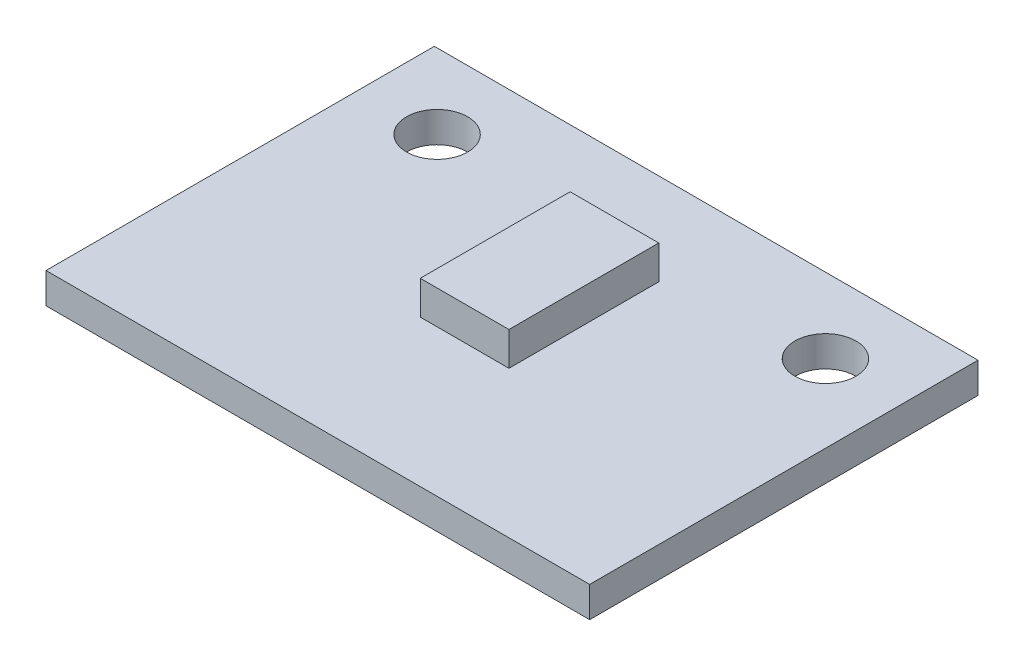
ISO-10303-21;
HEADER;
FILE_DESCRIPTION(('STEP AP214'),'2;1');
FILE_NAME('part.step','',(''),(''),'','','');
FILE_SCHEMA(('AUTOMOTIVE_DESIGN { 1 0 10303 214 1 1 1 1 }'));
ENDSEC;
DATA;
#1=APPLICATION_CONTEXT('core data for automotive mechanical design processes');
#2=APPLICATION_PROTOCOL_DEFINITION('international standard','automotive_design',2000,#1);
#3=PRODUCT_CONTEXT('',#1,'mechanical');
#4=PRODUCT('Part','Part','',(#3));
#5=PRODUCT_RELATED_PRODUCT_CATEGORY('part','',(#4));
#6=PRODUCT_DEFINITION_FORMATION('','',#4);
#7=PRODUCT_DEFINITION_CONTEXT('part definition',#1,'design');
#8=PRODUCT_DEFINITION('design','',#6,#7);
#9=PRODUCT_DEFINITION_SHAPE('','',#8);
#10=(LENGTH_UNIT() NAMED_UNIT(*) SI_UNIT(.MILLI.,.METRE.));
#11=(NAMED_UNIT(*) PLANE_ANGLE_UNIT() SI_UNIT($,.RADIAN.));
#12=(NAMED_UNIT(*) SI_UNIT($,.STERADIAN.) SOLID_ANGLE_UNIT());
#13=UNCERTAINTY_MEASURE_WITH_UNIT(LENGTH_MEASURE(1.E-05),#10,'distance_accuracy_value','');
#14=(GEOMETRIC_REPRESENTATION_CONTEXT(3) GLOBAL_UNCERTAINTY_ASSIGNED_CONTEXT((#13)) GLOBAL_UNIT_ASSIGNED_CONTEXT((#10,
#11,#12)) REPRESENTATION_CONTEXT('',''));
#15=CARTESIAN_POINT('',(0.,0.,0.));
#16=DIRECTION('',(0.,0.,1.));
#17=DIRECTION('',(1.,0.,0.));
#18=AXIS2_PLACEMENT_3D('',#15,#16,#17);
#19=CARTESIAN_POINT('',(0.,1.,6.35));
#20=DIRECTION('',(0.,0.,-1.));
#21=DIRECTION('',(-1.,0.,0.));
#22=AXIS2_PLACEMENT_3D('',#19,#20,#21);
#23=PLANE('',#22);
#24=DIRECTION('',(1.,0.,0.));
#25=VECTOR('',#24,1.);
#26=CARTESIAN_POINT('',(0.,0.,6.35));
#27=LINE('',#26,#25);
#28=CARTESIAN_POINT('',(-8.89,0.,6.35));
#29=VERTEX_POINT('',#28);
#30=CARTESIAN_POINT('',(8.89,0.,6.35));
#31=VERTEX_POINT('',#30);
#32=EDGE_CURVE('E206',#29,#31,#27,.T.);
#33=ORIENTED_EDGE('',*,*,#32,.T.);
#34=DIRECTION('',(0.,-1.,0.));
#35=VECTOR('',#34,1.);
#36=CARTESIAN_POINT('',(8.89,1.,6.35));
#37=LINE('',#36,#35);
#38=CARTESIAN_POINT('',(8.89,1.,6.35));
#39=VERTEX_POINT('',#38);
#40=EDGE_CURVE('E12',#39,#31,#37,.T.);
#41=ORIENTED_EDGE('',*,*,#40,.F.);
#42=DIRECTION('',(1.,0.,0.));
#43=VECTOR('',#42,1.);
#44=CARTESIAN_POINT('',(0.,1.,6.35));
#45=LINE('',#44,#43);
#46=CARTESIAN_POINT('',(-8.89,1.,6.35));
#47=VERTEX_POINT('',#46);
#48=EDGE_CURVE('E187',#47,#39,#45,.T.);
#49=ORIENTED_EDGE('',*,*,#48,.F.);
#50=DIRECTION('',(0.,-1.,0.));
#51=VECTOR('',#50,1.);
#52=CARTESIAN_POINT('',(-8.89,1.,6.35));
#53=LINE('',#52,#51);
#54=EDGE_CURVE('E76',#47,#29,#53,.T.);
#55=ORIENTED_EDGE('',*,*,#54,.T.);
#56=EDGE_LOOP('',(#33,#41,#49,#55));
#57=FACE_BOUND('',#56,.T.);
#58=ADVANCED_FACE('F51',(#57),#23,.F.);
#59=CARTESIAN_POINT('',(8.89,1.,0.));
#60=DIRECTION('',(-1.,0.,0.));
#61=DIRECTION('',(0.,0.,1.));
#62=AXIS2_PLACEMENT_3D('',#59,#60,#61);
#63=PLANE('',#62);
#64=DIRECTION('',(0.,0.,-1.));
#65=VECTOR('',#64,1.);
#66=CARTESIAN_POINT('',(8.89,0.,0.));
#67=LINE('',#66,#65);
#68=CARTESIAN_POINT('',(8.89,0.,-6.35));
#69=VERTEX_POINT('',#68);
#70=EDGE_CURVE('E209',#31,#69,#67,.T.);
#71=ORIENTED_EDGE('',*,*,#70,.T.);
#72=DIRECTION('',(0.,-1.,0.));
#73=VECTOR('',#72,1.);
#74=CARTESIAN_POINT('',(8.89,1.,-6.35));
#75=LINE('',#74,#73);
#76=CARTESIAN_POINT('',(8.89,1.,-6.35));
#77=VERTEX_POINT('',#76);
#78=EDGE_CURVE('E60',#77,#69,#75,.T.);
#79=ORIENTED_EDGE('',*,*,#78,.F.);
#80=DIRECTION('',(0.,0.,-1.));
#81=VECTOR('',#80,1.);
#82=CARTESIAN_POINT('',(8.89,1.,0.));
#83=LINE('',#82,#81);
#84=EDGE_CURVE('E102',#39,#77,#83,.T.);
#85=ORIENTED_EDGE('',*,*,#84,.F.);
#86=ORIENTED_EDGE('',*,*,#40,.T.);
#87=EDGE_LOOP('',(#71,#79,#85,#86));
#88=FACE_BOUND('',#87,.T.);
#89=ADVANCED_FACE('F229',(#88),#63,.F.);
#90=CARTESIAN_POINT('',(0.,1.,-6.35));
#91=DIRECTION('',(0.,0.,-1.));
#92=DIRECTION('',(-1.,0.,0.));
#93=AXIS2_PLACEMENT_3D('',#90,#91,#92);
#94=PLANE('',#93);
#95=DIRECTION('',(1.,0.,0.));
#96=VECTOR('',#95,1.);
#97=CARTESIAN_POINT('',(0.,0.,-6.35));
#98=LINE('',#97,#96);
#99=CARTESIAN_POINT('',(-8.89,0.,-6.35));
#100=VERTEX_POINT('',#99);
#101=EDGE_CURVE('E213',#100,#69,#98,.T.);
#102=ORIENTED_EDGE('',*,*,#101,.F.);
#103=DIRECTION('',(0.,-1.,0.));
#104=VECTOR('',#103,1.);
#105=CARTESIAN_POINT('',(-8.89,1.,-6.35));
#106=LINE('',#105,#104);
#107=CARTESIAN_POINT('',(-8.89,1.,-6.35));
#108=VERTEX_POINT('',#107);
#109=EDGE_CURVE('E222',#108,#100,#106,.T.);
#110=ORIENTED_EDGE('',*,*,#109,.F.);
#111=DIRECTION('',(1.,0.,0.));
#112=VECTOR('',#111,1.);
#113=CARTESIAN_POINT('',(0.,1.,-6.35));
#114=LINE('',#113,#112);
#115=EDGE_CURVE('E192',#108,#77,#114,.T.);
#116=ORIENTED_EDGE('',*,*,#115,.T.);
#117=ORIENTED_EDGE('',*,*,#78,.T.);
#118=EDGE_LOOP('',(#102,#110,#116,#117));
#119=FACE_BOUND('',#118,.T.);
#120=ADVANCED_FACE('F227',(#119),#94,.T.);
#121=CARTESIAN_POINT('',(-6.35,1.,-3.9));
#122=DIRECTION('',(0.,-1.,0.));
#123=DIRECTION('',(0.,0.,-1.));
#124=AXIS2_PLACEMENT_3D('',#121,#122,#123);
#125=CYLINDRICAL_SURFACE('',#124,1.);
#126=CARTESIAN_POINT('',(-6.35,1.,-3.9));
#127=DIRECTION('',(0.,1.,0.));
#128=DIRECTION('',(0.,0.,1.));
#129=AXIS2_PLACEMENT_3D('',#126,#127,#128);
#130=CIRCLE('',#129,1.);
#131=CARTESIAN_POINT('',(-6.35,1.,-2.9));
#132=VERTEX_POINT('',#131);
#133=EDGE_CURVE('E182',#132,#132,#130,.T.);
#134=ORIENTED_EDGE('',*,*,#133,.T.);
#135=EDGE_LOOP('',(#134));
#136=FACE_BOUND('',#135,.T.);
#137=CARTESIAN_POINT('',(-6.35,0.,-3.9));
#138=DIRECTION('',(0.,1.,0.));
#139=DIRECTION('',(0.,0.,1.));
#140=AXIS2_PLACEMENT_3D('',#137,#138,#139);
#141=CIRCLE('',#140,1.);
#142=CARTESIAN_POINT('',(-6.35,0.,-2.9));
#143=VERTEX_POINT('',#142);
#144=EDGE_CURVE('E202',#143,#143,#141,.T.);
#145=ORIENTED_EDGE('',*,*,#144,.F.);
#146=EDGE_LOOP('',(#145));
#147=FACE_BOUND('',#146,.T.);
#148=ADVANCED_FACE('F244',(#136,#147),#125,.F.);
#149=CARTESIAN_POINT('',(6.35,1.,-3.9));
#150=DIRECTION('',(0.,-1.,0.));
#151=DIRECTION('',(0.,0.,-1.));
#152=AXIS2_PLACEMENT_3D('',#149,#150,#151);
#153=CYLINDRICAL_SURFACE('',#152,1.);
#154=CARTESIAN_POINT('',(6.35,1.,-3.9));
#155=DIRECTION('',(0.,1.,0.));
#156=DIRECTION('',(0.,0.,1.));
#157=AXIS2_PLACEMENT_3D('',#154,#155,#156);
#158=CIRCLE('',#157,1.);
#159=CARTESIAN_POINT('',(6.35,1.,-2.9));
#160=VERTEX_POINT('',#159);
#161=EDGE_CURVE('E178',#160,#160,#158,.T.);
#162=ORIENTED_EDGE('',*,*,#161,.T.);
#163=EDGE_LOOP('',(#162));
#164=FACE_BOUND('',#163,.T.);
#165=CARTESIAN_POINT('',(6.35,0.,-3.9));
#166=DIRECTION('',(0.,1.,0.));
#167=DIRECTION('',(0.,0.,1.));
#168=AXIS2_PLACEMENT_3D('',#165,#166,#167);
#169=CIRCLE('',#168,1.);
#170=CARTESIAN_POINT('',(6.35,0.,-2.9));
#171=VERTEX_POINT('',#170);
#172=EDGE_CURVE('E177',#171,#171,#169,.T.);
#173=ORIENTED_EDGE('',*,*,#172,.F.);
#174=EDGE_LOOP('',(#173));
#175=FACE_BOUND('',#174,.T.);
#176=ADVANCED_FACE('F53',(#164,#175),#153,.F.);
#177=CARTESIAN_POINT('',(-8.89,1.,0.));
#178=DIRECTION('',(-1.,0.,0.));
#179=DIRECTION('',(0.,0.,1.));
#180=AXIS2_PLACEMENT_3D('',#177,#178,#179);
#181=PLANE('',#180);
#182=DIRECTION('',(0.,0.,-1.));
#183=VECTOR('',#182,1.);
#184=CARTESIAN_POINT('',(-8.89,0.,0.));
#185=LINE('',#184,#183);
#186=EDGE_CURVE('E183',#29,#100,#185,.T.);
#187=ORIENTED_EDGE('',*,*,#186,.F.);
#188=ORIENTED_EDGE('',*,*,#54,.F.);
#189=DIRECTION('',(0.,0.,-1.));
#190=VECTOR('',#189,1.);
#191=CARTESIAN_POINT('',(-8.89,1.,0.));
#192=LINE('',#191,#190);
#193=EDGE_CURVE('E196',#47,#108,#192,.T.);
#194=ORIENTED_EDGE('',*,*,#193,.T.);
#195=ORIENTED_EDGE('',*,*,#109,.T.);
#196=EDGE_LOOP('',(#187,#188,#194,#195));
#197=FACE_BOUND('',#196,.T.);
#198=ADVANCED_FACE('F233',(#197),#181,.T.);
#199=CARTESIAN_POINT('',(0.,1.,0.));
#200=DIRECTION('',(0.,1.,0.));
#201=DIRECTION('',(0.,0.,1.));
#202=AXIS2_PLACEMENT_3D('',#199,#200,#201);
#203=PLANE('',#202);
#204=DIRECTION('',(0.,0.,1.));
#205=VECTOR('',#204,1.);
#206=CARTESIAN_POINT('',(-1.45,1.,0.));
#207=LINE('',#206,#205);
#208=CARTESIAN_POINT('',(-1.45,1.,-3.35));
#209=VERTEX_POINT('',#208);
#210=CARTESIAN_POINT('',(-1.45,1.,1.55));
#211=VERTEX_POINT('',#210);
#212=EDGE_CURVE('E174',#209,#211,#207,.T.);
#213=ORIENTED_EDGE('',*,*,#212,.F.);
#214=DIRECTION('',(-1.,0.,0.));
#215=VECTOR('',#214,1.);
#216=CARTESIAN_POINT('',(0.,1.,-3.35));
#217=LINE('',#216,#215);
#218=CARTESIAN_POINT('',(1.45,1.,-3.35));
#219=VERTEX_POINT('',#218);
#220=EDGE_CURVE('E142',#219,#209,#217,.T.);
#221=ORIENTED_EDGE('',*,*,#220,.F.);
#222=DIRECTION('',(0.,0.,1.));
#223=VECTOR('',#222,1.);
#224=CARTESIAN_POINT('',(1.45,1.,0.));
#225=LINE('',#224,#223);
#226=CARTESIAN_POINT('',(1.45,1.,1.55));
#227=VERTEX_POINT('',#226);
#228=EDGE_CURVE('E168',#219,#227,#225,.T.);
#229=ORIENTED_EDGE('',*,*,#228,.T.);
#230=DIRECTION('',(-1.,0.,0.));
#231=VECTOR('',#230,1.);
#232=CARTESIAN_POINT('',(0.,1.,1.55));
#233=LINE('',#232,#231);
#234=EDGE_CURVE('E164',#227,#211,#233,.T.);
#235=ORIENTED_EDGE('',*,*,#234,.T.);
#236=EDGE_LOOP('',(#213,#221,#229,#235));
#237=FACE_BOUND('',#236,.T.);
#238=ORIENTED_EDGE('',*,*,#161,.F.);
#239=EDGE_LOOP('',(#238));
#240=FACE_BOUND('',#239,.T.);
#241=ORIENTED_EDGE('',*,*,#133,.F.);
#242=EDGE_LOOP('',(#241));
#243=FACE_BOUND('',#242,.T.);
#244=ORIENTED_EDGE('',*,*,#48,.T.);
#245=ORIENTED_EDGE('',*,*,#84,.T.);
#246=ORIENTED_EDGE('',*,*,#115,.F.);
#247=ORIENTED_EDGE('',*,*,#193,.F.);
#248=EDGE_LOOP('',(#244,#245,#246,#247));
#249=FACE_BOUND('',#248,.T.);
#250=ADVANCED_FACE('F236',(#237,#240,#243,#249),#203,.T.);
#251=CARTESIAN_POINT('',(0.,0.,0.));
#252=DIRECTION('',(0.,1.,0.));
#253=DIRECTION('',(0.,0.,1.));
#254=AXIS2_PLACEMENT_3D('',#251,#252,#253);
#255=PLANE('',#254);
#256=ORIENTED_EDGE('',*,*,#172,.T.);
#257=EDGE_LOOP('',(#256));
#258=FACE_BOUND('',#257,.T.);
#259=ORIENTED_EDGE('',*,*,#144,.T.);
#260=EDGE_LOOP('',(#259));
#261=FACE_BOUND('',#260,.T.);
#262=ORIENTED_EDGE('',*,*,#32,.F.);
#263=ORIENTED_EDGE('',*,*,#186,.T.);
#264=ORIENTED_EDGE('',*,*,#101,.T.);
#265=ORIENTED_EDGE('',*,*,#70,.F.);
#266=EDGE_LOOP('',(#262,#263,#264,#265));
#267=FACE_BOUND('',#266,.T.);
#268=ADVANCED_FACE('F232',(#258,#261,#267),#255,.F.);
#269=CARTESIAN_POINT('',(0.,2.1,0.));
#270=DIRECTION('',(0.,1.,0.));
#271=DIRECTION('',(0.,0.,1.));
#272=AXIS2_PLACEMENT_3D('',#269,#270,#271);
#273=PLANE('',#272);
#274=DIRECTION('',(0.,0.,-1.));
#275=VECTOR('',#274,1.);
#276=CARTESIAN_POINT('',(-1.45,2.1,0.));
#277=LINE('',#276,#275);
#278=CARTESIAN_POINT('',(-1.45,2.1,1.55));
#279=VERTEX_POINT('',#278);
#280=CARTESIAN_POINT('',(-1.45,2.1,-3.35));
#281=VERTEX_POINT('',#280);
#282=EDGE_CURVE('E129',#279,#281,#277,.T.);
#283=ORIENTED_EDGE('',*,*,#282,.F.);
#284=DIRECTION('',(1.,0.,0.));
#285=VECTOR('',#284,1.);
#286=CARTESIAN_POINT('',(0.,2.1,1.55));
#287=LINE('',#286,#285);
#288=CARTESIAN_POINT('',(1.45,2.1,1.55));
#289=VERTEX_POINT('',#288);
#290=EDGE_CURVE('E151',#279,#289,#287,.T.);
#291=ORIENTED_EDGE('',*,*,#290,.T.);
#292=DIRECTION('',(0.,0.,-1.));
#293=VECTOR('',#292,1.);
#294=CARTESIAN_POINT('',(1.45,2.1,0.));
#295=LINE('',#294,#293);
#296=CARTESIAN_POINT('',(1.45,2.1,-3.35));
#297=VERTEX_POINT('',#296);
#298=EDGE_CURVE('E131',#289,#297,#295,.T.);
#299=ORIENTED_EDGE('',*,*,#298,.T.);
#300=DIRECTION('',(1.,0.,0.));
#301=VECTOR('',#300,1.);
#302=CARTESIAN_POINT('',(0.,2.1,-3.35));
#303=LINE('',#302,#301);
#304=EDGE_CURVE('E125',#281,#297,#303,.T.);
#305=ORIENTED_EDGE('',*,*,#304,.F.);
#306=EDGE_LOOP('',(#283,#291,#299,#305));
#307=FACE_BOUND('',#306,.T.);
#308=ADVANCED_FACE('F127',(#307),#273,.T.);
#309=CARTESIAN_POINT('',(-1.45,8.8938563381947,0.));
#310=DIRECTION('',(-1.,0.,0.));
#311=DIRECTION('',(0.,0.,1.));
#312=AXIS2_PLACEMENT_3D('',#309,#310,#311);
#313=PLANE('',#312);
#314=DIRECTION('',(0.,-1.,0.));
#315=VECTOR('',#314,1.);
#316=CARTESIAN_POINT('',(-1.45,8.8938563381947,-3.35));
#317=LINE('',#316,#315);
#318=EDGE_CURVE('E137',#281,#209,#317,.T.);
#319=ORIENTED_EDGE('',*,*,#318,.T.);
#320=ORIENTED_EDGE('',*,*,#212,.T.);
#321=DIRECTION('',(0.,-1.,0.));
#322=VECTOR('',#321,1.);
#323=CARTESIAN_POINT('',(-1.45,8.8938563381947,1.55));
#324=LINE('',#323,#322);
#325=EDGE_CURVE('E67',#279,#211,#324,.T.);
#326=ORIENTED_EDGE('',*,*,#325,.F.);
#327=ORIENTED_EDGE('',*,*,#282,.T.);
#328=EDGE_LOOP('',(#319,#320,#326,#327));
#329=FACE_BOUND('',#328,.T.);
#330=ADVANCED_FACE('F147',(#329),#313,.T.);
#331=CARTESIAN_POINT('',(0.,8.8938563381947,-3.35));
#332=DIRECTION('',(0.,0.,-1.));
#333=DIRECTION('',(-1.,0.,0.));
#334=AXIS2_PLACEMENT_3D('',#331,#332,#333);
#335=PLANE('',#334);
#336=DIRECTION('',(0.,-1.,0.));
#337=VECTOR('',#336,1.);
#338=CARTESIAN_POINT('',(1.45,8.8938563381947,-3.35));
#339=LINE('',#338,#337);
#340=EDGE_CURVE('E136',#297,#219,#339,.T.);
#341=ORIENTED_EDGE('',*,*,#340,.T.);
#342=ORIENTED_EDGE('',*,*,#220,.T.);
#343=ORIENTED_EDGE('',*,*,#318,.F.);
#344=ORIENTED_EDGE('',*,*,#304,.T.);
#345=EDGE_LOOP('',(#341,#342,#343,#344));
#346=FACE_BOUND('',#345,.T.);
#347=ADVANCED_FACE('F140',(#346),#335,.T.);
#348=CARTESIAN_POINT('',(1.45,8.8938563381947,0.));
#349=DIRECTION('',(-1.,0.,0.));
#350=DIRECTION('',(0.,0.,1.));
#351=AXIS2_PLACEMENT_3D('',#348,#349,#350);
#352=PLANE('',#351);
#353=ORIENTED_EDGE('',*,*,#228,.F.);
#354=ORIENTED_EDGE('',*,*,#340,.F.);
#355=ORIENTED_EDGE('',*,*,#298,.F.);
#356=DIRECTION('',(0.,-1.,0.));
#357=VECTOR('',#356,1.);
#358=CARTESIAN_POINT('',(1.45,8.8938563381947,1.55));
#359=LINE('',#358,#357);
#360=EDGE_CURVE('E156',#289,#227,#359,.T.);
#361=ORIENTED_EDGE('',*,*,#360,.T.);
#362=EDGE_LOOP('',(#353,#354,#355,#361));
#363=FACE_BOUND('',#362,.T.);
#364=ADVANCED_FACE('F303',(#363),#352,.F.);
#365=CARTESIAN_POINT('',(0.,8.8938563381947,1.55));
#366=DIRECTION('',(0.,0.,-1.));
#367=DIRECTION('',(-1.,0.,0.));
#368=AXIS2_PLACEMENT_3D('',#365,#366,#367);
#369=PLANE('',#368);
#370=ORIENTED_EDGE('',*,*,#234,.F.);
#371=ORIENTED_EDGE('',*,*,#360,.F.);
#372=ORIENTED_EDGE('',*,*,#290,.F.);
#373=ORIENTED_EDGE('',*,*,#325,.T.);
#374=EDGE_LOOP('',(#370,#371,#372,#373));
#375=FACE_BOUND('',#374,.T.);
#376=ADVANCED_FACE('F312',(#375),#369,.F.);
#377=CLOSED_SHELL('',(#58,#89,#120,#148,#176,#198,#250,#268,#308,#330,#347,#364,#376));
#378=MANIFOLD_SOLID_BREP('B2',#377);
#379=ADVANCED_BREP_SHAPE_REPRESENTATION('',(#18,#378),#14);
#380=SHAPE_DEFINITION_REPRESENTATION(#9,#379);
ENDSEC;
END-ISO-10303-21;
